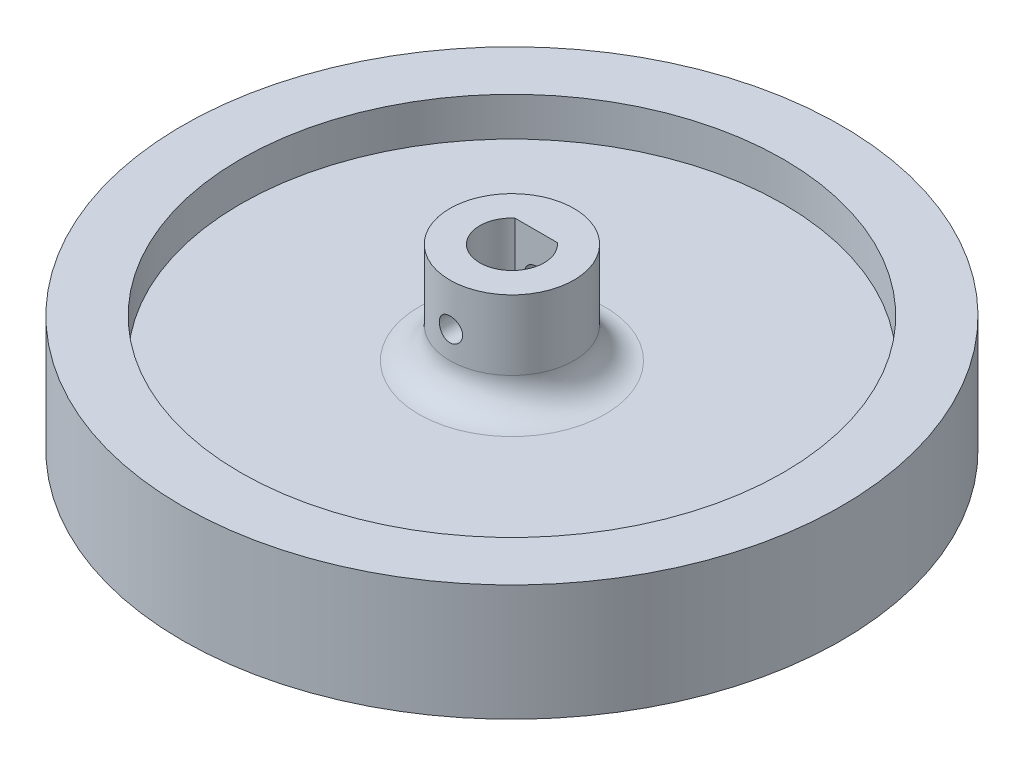
ISO-10303-21;
HEADER;
FILE_DESCRIPTION(('STEP AP214'),'2;1');
FILE_NAME('part.step','',(''),(''),'','','');
FILE_SCHEMA(('AUTOMOTIVE_DESIGN { 1 0 10303 214 1 1 1 1 }'));
ENDSEC;
DATA;
#1=APPLICATION_CONTEXT('core data for automotive mechanical design processes');
#2=APPLICATION_PROTOCOL_DEFINITION('international standard','automotive_design',2000,#1);
#3=PRODUCT_CONTEXT('',#1,'mechanical');
#4=PRODUCT('Part','Part','',(#3));
#5=PRODUCT_RELATED_PRODUCT_CATEGORY('part','',(#4));
#6=PRODUCT_DEFINITION_FORMATION('','',#4);
#7=PRODUCT_DEFINITION_CONTEXT('part definition',#1,'design');
#8=PRODUCT_DEFINITION('design','',#6,#7);
#9=PRODUCT_DEFINITION_SHAPE('','',#8);
#10=(LENGTH_UNIT() NAMED_UNIT(*) SI_UNIT(.MILLI.,.METRE.));
#11=(NAMED_UNIT(*) PLANE_ANGLE_UNIT() SI_UNIT($,.RADIAN.));
#12=(NAMED_UNIT(*) SI_UNIT($,.STERADIAN.) SOLID_ANGLE_UNIT());
#13=UNCERTAINTY_MEASURE_WITH_UNIT(LENGTH_MEASURE(1.E-05),#10,'distance_accuracy_value','');
#14=(GEOMETRIC_REPRESENTATION_CONTEXT(3) GLOBAL_UNCERTAINTY_ASSIGNED_CONTEXT((#13)) GLOBAL_UNIT_ASSIGNED_CONTEXT((#10,
#11,#12)) REPRESENTATION_CONTEXT('',''));
#15=CARTESIAN_POINT('',(0.,0.,0.));
#16=DIRECTION('',(0.,0.,1.));
#17=DIRECTION('',(1.,0.,0.));
#18=AXIS2_PLACEMENT_3D('',#15,#16,#17);
#19=CARTESIAN_POINT('',(0.,15.5,0.));
#20=DIRECTION('',(0.,-1.,0.));
#21=DIRECTION('',(0.,0.,-1.));
#22=AXIS2_PLACEMENT_3D('',#19,#20,#21);
#23=CYLINDRICAL_SURFACE('',#22,8.);
#24=CARTESIAN_POINT('',(0.,6.5,0.));
#25=DIRECTION('',(0.,1.,0.));
#26=DIRECTION('',(0.,0.,1.));
#27=AXIS2_PLACEMENT_3D('',#24,#25,#26);
#28=CIRCLE('',#27,8.);
#29=CARTESIAN_POINT('',(0.,6.5,8.));
#30=VERTEX_POINT('',#29);
#31=EDGE_CURVE('E57',#30,#30,#28,.T.);
#32=ORIENTED_EDGE('',*,*,#31,.T.);
#33=EDGE_LOOP('',(#32));
#34=FACE_BOUND('',#33,.T.);
#35=CARTESIAN_POINT('',(0.,15.5,0.));
#36=DIRECTION('',(0.,1.,0.));
#37=DIRECTION('',(0.,0.,1.));
#38=AXIS2_PLACEMENT_3D('',#35,#36,#37);
#39=CIRCLE('',#38,8.);
#40=CARTESIAN_POINT('',(0.,15.5,8.));
#41=VERTEX_POINT('',#40);
#42=EDGE_CURVE('E89',#41,#41,#39,.T.);
#43=ORIENTED_EDGE('',*,*,#42,.F.);
#44=EDGE_LOOP('',(#43));
#45=FACE_BOUND('',#44,.T.);
#46=CARTESIAN_POINT('',(-1.5,10.,7.85811682275085));
#47=CARTESIAN_POINT('',(-1.49999679883246,9.91654279198826,7.85811843793493));
#48=CARTESIAN_POINT('',(-1.49301126348936,9.83304405178161,7.85946079760266));
#49=CARTESIAN_POINT('',(-1.46527253251805,9.66840103841809,7.86467851014364));
#50=CARTESIAN_POINT('',(-1.44450765768477,9.58725882357252,7.86855601173205));
#51=CARTESIAN_POINT('',(-1.38987035617788,9.42973492862913,7.87838976464885));
#52=CARTESIAN_POINT('',(-1.35601013954374,9.35334889069271,7.88434407905997));
#53=CARTESIAN_POINT('',(-1.27617565760366,9.20734644071319,7.89765826320959));
#54=CARTESIAN_POINT('',(-1.23020233759193,9.1377295009967,7.90501802325622));
#55=CARTESIAN_POINT('',(-1.12683678942622,9.00636980080087,7.92041614838944));
#56=CARTESIAN_POINT('',(-1.06932292933092,8.94472351652827,7.92846116625679));
#57=CARTESIAN_POINT('',(-0.944771778803552,8.83189561040044,7.94426457664034));
#58=CARTESIAN_POINT('',(-0.877733863624945,8.78071467557521,7.95202295031153));
#59=CARTESIAN_POINT('',(-0.735403894570163,8.68990062339948,7.96645017828405));
#60=CARTESIAN_POINT('',(-0.660052840033866,8.65035846648058,7.97311028052363));
#61=CARTESIAN_POINT('',(-0.503631283250763,8.58453045772647,7.98451608632931));
#62=CARTESIAN_POINT('',(-0.422561251859506,8.55824351600978,7.98926194728334));
#63=CARTESIAN_POINT('',(-0.258002746187416,8.51997045138887,7.99625755123778));
#64=CARTESIAN_POINT('',(-0.174553323244857,8.50782169407731,7.99853565976327));
#65=CARTESIAN_POINT('',(-0.00677167603538331,8.4976631122996,8.00043684615594));
#66=CARTESIAN_POINT('',(0.0775604724476698,8.49965208386094,8.00006015010697));
#67=CARTESIAN_POINT('',(0.243598357899396,8.51758777114715,7.99671633763241));
#68=CARTESIAN_POINT('',(0.325323760451469,8.53335936943001,7.99378172247214));
#69=CARTESIAN_POINT('',(0.484947165715475,8.57813564939524,7.98568826333561));
#70=CARTESIAN_POINT('',(0.56284502882654,8.6071408133458,7.98052933829966));
#71=CARTESIAN_POINT('',(0.71311006575152,8.6777277310583,7.96851260297339));
#72=CARTESIAN_POINT('',(0.785443571838532,8.7193794879125,7.96164537590825));
#73=CARTESIAN_POINT('',(0.922159977214637,8.81402566907715,7.9469714754285));
#74=CARTESIAN_POINT('',(0.986542066910784,8.86702124688758,7.93916470651164));
#75=CARTESIAN_POINT('',(1.10656561896904,8.98381570298353,7.92333513680567));
#76=CARTESIAN_POINT('',(1.16205790757041,9.04776778390208,7.91531085901621));
#77=CARTESIAN_POINT('',(1.2615517185126,9.18414953127862,7.90006508924621));
#78=CARTESIAN_POINT('',(1.30555307271182,9.25657932176463,7.89284360901351));
#79=CARTESIAN_POINT('',(1.38085852224478,9.40805827070266,7.88001893307121));
#80=CARTESIAN_POINT('',(1.41214093645421,9.48711845719064,7.87441850530261));
#81=CARTESIAN_POINT('',(1.46093656975056,9.6495011841232,7.86551242396689));
#82=CARTESIAN_POINT('',(1.47845134901108,9.73282324046479,7.8622065103862));
#83=CARTESIAN_POINT('',(1.49899672649739,9.90001932885588,7.85831520301005));
#84=CARTESIAN_POINT('',(1.50224164285859,9.98386611556552,7.85768955816137));
#85=CARTESIAN_POINT('',(1.49472968881724,10.1509034550871,7.8591219142084));
#86=CARTESIAN_POINT('',(1.48397351086433,10.2340940401481,7.86117978238611));
#87=CARTESIAN_POINT('',(1.44894868195883,10.3967529030544,7.86770980063205));
#88=CARTESIAN_POINT('',(1.4247923858399,10.4762462526249,7.87216186690878));
#89=CARTESIAN_POINT('',(1.3637722437906,10.6300571897302,7.88296134156619));
#90=CARTESIAN_POINT('',(1.32690746128795,10.7043743953153,7.88930888963281));
#91=CARTESIAN_POINT('',(1.2410235311966,10.8466676190432,7.90327577863685));
#92=CARTESIAN_POINT('',(1.19186899639621,10.9145605378661,7.91090895425315));
#93=CARTESIAN_POINT('',(1.08298344344247,11.0412120402143,7.926548113681));
#94=CARTESIAN_POINT('',(1.02325147433084,11.0999698015558,7.93455413096494));
#95=CARTESIAN_POINT('',(0.893949417870386,11.2074837635341,7.95016624005946));
#96=CARTESIAN_POINT('',(0.824258534095891,11.256095826606,7.95776555833305));
#97=CARTESIAN_POINT('',(0.677574523040141,11.3409212061777,7.97159404810351));
#98=CARTESIAN_POINT('',(0.600581677038529,11.377135000025,7.97782327234725));
#99=CARTESIAN_POINT('',(0.441877541578685,11.4359200978641,7.98818057995848));
#100=CARTESIAN_POINT('',(0.360193213078989,11.4585621875614,7.99231954730142));
#101=CARTESIAN_POINT('',(0.194096227381571,11.4897870482899,7.99807642083745));
#102=CARTESIAN_POINT('',(0.109683858215851,11.4983712986627,7.99969459229933));
#103=CARTESIAN_POINT('',(-0.0580907602505088,11.5011853015184,8.00022227515441));
#104=CARTESIAN_POINT('',(-0.141449307066268,11.4956327531295,7.99917286625032));
#105=CARTESIAN_POINT('',(-0.306023369279199,11.4708075722316,7.99456866611703));
#106=CARTESIAN_POINT('',(-0.387238905213689,11.4515350712558,7.99101389890671));
#107=CARTESIAN_POINT('',(-0.545106475595484,11.3999087926163,7.98179837978045));
#108=CARTESIAN_POINT('',(-0.621766319318224,11.367578187119,7.97614135981576));
#109=CARTESIAN_POINT('',(-0.768605631316694,11.2907795463448,7.96333372068771));
#110=CARTESIAN_POINT('',(-0.83878466500327,11.2463106978933,7.95618300146483));
#111=CARTESIAN_POINT('',(-0.971755027780005,11.1457485455577,7.94104779859941));
#112=CARTESIAN_POINT('',(-1.03442623539053,11.0894979661383,7.93305284591272));
#113=CARTESIAN_POINT('',(-1.14951536065485,10.9672954375073,7.91719633538833));
#114=CARTESIAN_POINT('',(-1.2019308632478,10.9013412096263,7.90933480936765));
#115=CARTESIAN_POINT('',(-1.29547633945385,10.7608735452967,7.89455577425926));
#116=CARTESIAN_POINT('',(-1.33649740531872,10.6862865603324,7.88764767280729));
#117=CARTESIAN_POINT('',(-1.40536132423416,10.5311742100203,7.87567084650033));
#118=CARTESIAN_POINT('',(-1.43321661638912,10.4506545334106,7.87060038649116));
#119=CARTESIAN_POINT('',(-1.46929726596175,10.3082477119341,7.86393016292125));
#120=CARTESIAN_POINT('',(-1.4807910573985,10.2471942762381,7.86176310717932));
#121=CARTESIAN_POINT('',(-1.49614351076215,10.1241015315797,7.85885585595504));
#122=CARTESIAN_POINT('',(-1.50000238052127,10.0620622494997,7.85811562163282));
#123=CARTESIAN_POINT('',(-1.5,10.,7.85811682275085));
#124=B_SPLINE_CURVE_WITH_KNOTS('',3,(#46,#47,#48,#49,#50,#51,#52,#53,#54,#55,#56,#57,#58,#59,
#60,#61,#62,#63,#64,#65,#66,#67,#68,#69,#70,#71,#72,#73,#74,#75,#76,#77,#78,#79,#80,#81,#82,#83,
#84,#85,#86,#87,#88,#89,#90,#91,#92,#93,#94,#95,#96,#97,#98,#99,#100,#101,#102,#103,#104,#105,
#106,#107,#108,#109,#110,#111,#112,#113,#114,#115,#116,#117,#118,#119,#120,#121,#122,#123),
.UNSPECIFIED.,.T.,.F.,(4,2,2,2,2,2,2,2,2,2,2,2,2,2,2,2,2,2,2,2,2,2,2,2,2,2,2,2,2,2,2,2,2,2,2,2,
2,2,4),(0.,0.250144505793185,0.500501302380392,0.750625227978431,1.00072963993908,
1.25362335698691,1.50653367069315,1.76137104348047,2.0161874593964,2.26804275460261,
2.51987660200648,2.76855650598725,3.01724547328424,3.26733691984219,3.51745380911785,
3.77140614764064,4.025362201924,4.27974936118266,4.53410768866487,4.78463248587075,
5.03514489338718,5.28358792315369,5.53204926624317,5.78337862654143,6.03473059394677,
6.2894412549587,6.54414210821705,6.79750269418683,7.0508366166733,7.30029300570138,
7.54974700322167,7.79876026530358,8.0477902135711,8.30038464008745,8.55303847730765,
8.80803001818118,9.06278015749119,9.24880307527215,9.43482092920425),.UNSPECIFIED.);
#125=CARTESIAN_POINT('',(-1.5,10.,7.85811682275085));
#126=VERTEX_POINT('',#125);
#127=EDGE_CURVE('E98',#126,#126,#124,.T.);
#128=ORIENTED_EDGE('',*,*,#127,.F.);
#129=EDGE_LOOP('',(#128));
#130=FACE_BOUND('',#129,.T.);
#131=CARTESIAN_POINT('',(0.,11.5,-8.));
#132=CARTESIAN_POINT('',(0.0834717464654708,11.4999968104117,-7.99999848833852));
#133=CARTESIAN_POINT('',(0.166984992730098,11.4930089233806,-7.99868009921714));
#134=CARTESIAN_POINT('',(0.331658129841797,11.4652600048817,-7.9935478589052));
#135=CARTESIAN_POINT('',(0.412815974152225,11.4444873493603,-7.98973190166897));
#136=CARTESIAN_POINT('',(0.570372961851801,11.3898272987407,-7.98003138765458));
#137=CARTESIAN_POINT('',(0.646776330685343,11.3559517475475,-7.97414869946483));
#138=CARTESIAN_POINT('',(0.792807973094006,11.2760811230772,-7.96095710599783));
#139=CARTESIAN_POINT('',(0.862436794477323,11.2300870308552,-7.9536483161829));
#140=CARTESIAN_POINT('',(0.993783715930502,11.1267002319963,-7.93831336430504));
#141=CARTESIAN_POINT('',(1.05540895503183,11.0691905553299,-7.93028034856351));
#142=CARTESIAN_POINT('',(1.16819606135369,10.9446566909124,-7.9144531845865));
#143=CARTESIAN_POINT('',(1.21935717689241,10.8776318202307,-7.90665905354527));
#144=CARTESIAN_POINT('',(1.31014998665793,10.735313911636,-7.89212551245005));
#145=CARTESIAN_POINT('',(1.34968721969605,10.6599596296828,-7.88539493886182));
#146=CARTESIAN_POINT('',(1.41550524332283,10.5035310848232,-7.87384713211987));
#147=CARTESIAN_POINT('',(1.44178717713098,10.4224573158888,-7.86902973396962));
#148=CARTESIAN_POINT('',(1.480050535035,10.2578847690856,-7.8619226957455));
#149=CARTESIAN_POINT('',(1.49219390192039,10.1744249027965,-7.85960445366405));
#150=CARTESIAN_POINT('',(1.50233808095346,10.0066226151918,-7.85767197152761));
#151=CARTESIAN_POINT('',(1.50034016135374,9.9222802736977,-7.8580574889876));
#152=CARTESIAN_POINT('',(1.48238979602362,9.75628047473395,-7.86146292701753));
#153=CARTESIAN_POINT('',(1.46662149996045,9.67460228569985,-7.86444808147334));
#154=CARTESIAN_POINT('',(1.42186799396207,9.51507158021739,-7.87266183284666));
#155=CARTESIAN_POINT('',(1.39288222239499,9.4372192264907,-7.87789052509516));
#156=CARTESIAN_POINT('',(1.322336471793,9.28701132099973,-7.89003855292589));
#157=CARTESIAN_POINT('',(1.28070213532456,9.21469152941919,-7.89696783823366));
#158=CARTESIAN_POINT('',(1.18609368930416,9.07799527145977,-7.91172971602918));
#159=CARTESIAN_POINT('',(1.13311842889266,9.0136196122852,-7.91956240015522));
#160=CARTESIAN_POINT('',(1.01633905685298,8.89357504432754,-7.93540001272164));
#161=CARTESIAN_POINT('',(0.952377436860682,8.83805934754826,-7.94340571024031));
#162=CARTESIAN_POINT('',(0.815968037098826,8.73852275932459,-7.95857386108318));
#163=CARTESIAN_POINT('',(0.743520172255769,8.69450198312958,-7.96573630595245));
#164=CARTESIAN_POINT('',(0.592034988874667,8.61918224612998,-7.97842539677509));
#165=CARTESIAN_POINT('',(0.512989564446493,8.5878992208821,-7.98394999136289));
#166=CARTESIAN_POINT('',(0.350639115398696,8.53909790690784,-7.99272505402719));
#167=CARTESIAN_POINT('',(0.267334544277787,8.52157815595464,-7.99597576367994));
#168=CARTESIAN_POINT('',(0.100148652903385,8.50101396898173,-7.99980360641981));
#169=CARTESIAN_POINT('',(0.0162940126341357,8.49775960847027,-8.00041950912279));
#170=CARTESIAN_POINT('',(-0.150761248092183,8.50525547954765,-7.99901543598228));
#171=CARTESIAN_POINT('',(-0.233961900480385,8.51600502306526,-7.99699558964431));
#172=CARTESIAN_POINT('',(-0.396681573218217,8.55102903518337,-7.99057111500406));
#173=CARTESIAN_POINT('',(-0.476224261046063,8.57519728253781,-7.98618522374031));
#174=CARTESIAN_POINT('',(-0.630128631824632,8.63625770677879,-7.97551842212498));
#175=CARTESIAN_POINT('',(-0.704489962595103,8.67315074756579,-7.96923738311334));
#176=CARTESIAN_POINT('',(-0.846816671513214,8.75907812815951,-7.95538030357666));
#177=CARTESIAN_POINT('',(-0.914703277015121,8.80824073853684,-7.94779086174563));
#178=CARTESIAN_POINT('',(-1.04133832326454,8.91713813736236,-7.93219343489712));
#179=CARTESIAN_POINT('',(-1.10008590976087,8.97687391300133,-7.92418541084687));
#180=CARTESIAN_POINT('',(-1.20757295872048,9.10617231891143,-7.9085247569745));
#181=CARTESIAN_POINT('',(-1.25616916218577,9.17585490812539,-7.90087825860257));
#182=CARTESIAN_POINT('',(-1.34096675057787,9.32251762452375,-7.88692985578532));
#183=CARTESIAN_POINT('',(-1.37716859613924,9.39949748037047,-7.8806279013735));
#184=CARTESIAN_POINT('',(-1.43594673512823,9.55820586724254,-7.87013024209574));
#185=CARTESIAN_POINT('',(-1.45858868794786,9.63990937955933,-7.86592440436878));
#186=CARTESIAN_POINT('',(-1.48980679326235,9.8060472225214,-7.86007203802415));
#187=CARTESIAN_POINT('',(-1.49838453270708,9.8904812439704,-7.8584252206579));
#188=CARTESIAN_POINT('',(-1.50117762148355,10.0582483314415,-7.85789199803857));
#189=CARTESIAN_POINT('',(-1.49561895003499,10.141577580957,-7.85896215974293));
#190=CARTESIAN_POINT('',(-1.47079175378803,10.3060914220453,-7.86364600659998));
#191=CARTESIAN_POINT('',(-1.45152331089332,10.3872760264274,-7.86725967655747));
#192=CARTESIAN_POINT('',(-1.39991887583263,10.5450744847955,-7.8766050802318));
#193=CARTESIAN_POINT('',(-1.36760735397252,10.6216965913458,-7.88233284594965));
#194=CARTESIAN_POINT('',(-1.29085868912204,10.7684682542408,-7.8952638755184));
#195=CARTESIAN_POINT('',(-1.24642068948186,10.8386173528448,-7.90246724360119));
#196=CARTESIAN_POINT('',(-1.14589487339535,10.9715836800423,-7.91767266107745));
#197=CARTESIAN_POINT('',(-1.08964259864303,11.0342754125671,-7.92568505353043));
#198=CARTESIAN_POINT('',(-0.96742792674229,11.1494051624645,-7.94152833918735));
#199=CARTESIAN_POINT('',(-0.901463301891615,11.2018408209801,-7.94935919027328));
#200=CARTESIAN_POINT('',(-0.760984945071872,11.2954109526271,-7.96403975968049));
#201=CARTESIAN_POINT('',(-0.686399590640516,11.3364394284906,-7.97088000990561));
#202=CARTESIAN_POINT('',(-0.531290113653833,11.4053176366051,-7.98271619380687));
#203=CARTESIAN_POINT('',(-0.450771651705247,11.4331797470469,-7.98771385879037));
#204=CARTESIAN_POINT('',(-0.308347202825153,11.4692773144187,-7.99428290707632));
#205=CARTESIAN_POINT('',(-0.24727381025187,11.4807786303128,-7.99641470878206));
#206=CARTESIAN_POINT('',(-0.124141247115158,11.4961410621164,-7.9992737995401));
#207=CARTESIAN_POINT('',(-0.0620821016527094,11.5000023722559,-8.00000112429805));
#208=CARTESIAN_POINT('',(0.,11.5,-8.));
#209=B_SPLINE_CURVE_WITH_KNOTS('',3,(#131,#132,#133,#134,#135,#136,#137,#138,#139,#140,#141,
#142,#143,#144,#145,#146,#147,#148,#149,#150,#151,#152,#153,#154,#155,#156,#157,#158,#159,#160,
#161,#162,#163,#164,#165,#166,#167,#168,#169,#170,#171,#172,#173,#174,#175,#176,#177,#178,#179,
#180,#181,#182,#183,#184,#185,#186,#187,#188,#189,#190,#191,#192,#193,#194,#195,#196,#197,#198,
#199,#200,#201,#202,#203,#204,#205,#206,#207,#208),.UNSPECIFIED.,.T.,.F.,(4,2,2,2,2,2,2,2,2,2,2,
2,2,2,2,2,2,2,2,2,2,2,2,2,2,2,2,2,2,2,2,2,2,2,2,2,2,2,4),(0.,0.250188200964924,
0.500587642535452,0.750761271230907,1.00091465336891,1.2537511801363,1.50660586283617,
1.76146190504357,2.01629596311949,2.26818151445336,2.52004447587256,2.76859000612766,
3.01714609846787,3.26719262629531,3.51726454049859,3.77127768464077,4.02529337544948,
4.27962588321699,4.53393136673745,4.78448174076096,5.03501980464583,5.28360233907828,
5.53220175338032,5.78351778017708,6.03485728413098,6.28953436987299,6.54420198954945,
6.79762627818559,7.05102196946513,7.30039252231748,7.54976158541506,7.79866496207692,
8.04758592655423,8.3002336996638,8.55293951262255,8.80792048916314,9.06266126931173,
9.24874344524409,9.43482089039541),.UNSPECIFIED.);
#210=CARTESIAN_POINT('',(0.,11.5,-8.));
#211=VERTEX_POINT('',#210);
#212=EDGE_CURVE('E94',#211,#211,#209,.T.);
#213=ORIENTED_EDGE('',*,*,#212,.F.);
#214=EDGE_LOOP('',(#213));
#215=FACE_BOUND('',#214,.T.);
#216=ADVANCED_FACE('F47',(#34,#45,#130,#215),#23,.T.);
#217=CARTESIAN_POINT('',(0.,15.5,0.));
#218=DIRECTION('',(0.,-1.,0.));
#219=DIRECTION('',(0.,0.,-1.));
#220=AXIS2_PLACEMENT_3D('',#217,#218,#219);
#221=CYLINDRICAL_SURFACE('',#220,4.15);
#222=CARTESIAN_POINT('',(0.,2.5,0.));
#223=DIRECTION('',(0.,1.,0.));
#224=DIRECTION('',(0.,0.,1.));
#225=AXIS2_PLACEMENT_3D('',#222,#223,#224);
#226=CIRCLE('',#225,4.15);
#227=CARTESIAN_POINT('',(-2.74496698526911,2.5,-3.11249999996507));
#228=VERTEX_POINT('',#227);
#229=CARTESIAN_POINT('',(2.74496698526911,2.5,-3.11249999996508));
#230=VERTEX_POINT('',#229);
#231=EDGE_CURVE('E71',#228,#230,#226,.T.);
#232=ORIENTED_EDGE('',*,*,#231,.F.);
#233=DIRECTION('',(0.,-1.,0.));
#234=VECTOR('',#233,1.);
#235=CARTESIAN_POINT('',(-2.74496698526911,15.5,-3.11249999996507));
#236=LINE('',#235,#234);
#237=CARTESIAN_POINT('',(-2.74496698526911,15.5,-3.11249999996507));
#238=VERTEX_POINT('',#237);
#239=EDGE_CURVE('E79',#238,#228,#236,.T.);
#240=ORIENTED_EDGE('',*,*,#239,.F.);
#241=CARTESIAN_POINT('',(0.,15.5,0.));
#242=DIRECTION('',(0.,1.,0.));
#243=DIRECTION('',(0.,0.,1.));
#244=AXIS2_PLACEMENT_3D('',#241,#242,#243);
#245=CIRCLE('',#244,4.15);
#246=CARTESIAN_POINT('',(2.74496698526911,15.5,-3.11249999996508));
#247=VERTEX_POINT('',#246);
#248=EDGE_CURVE('E82',#238,#247,#245,.T.);
#249=ORIENTED_EDGE('',*,*,#248,.T.);
#250=DIRECTION('',(0.,-1.,0.));
#251=VECTOR('',#250,1.);
#252=CARTESIAN_POINT('',(2.74496698526911,15.5,-3.11249999996508));
#253=LINE('',#252,#251);
#254=EDGE_CURVE('E64',#247,#230,#253,.T.);
#255=ORIENTED_EDGE('',*,*,#254,.T.);
#256=EDGE_LOOP('',(#232,#240,#249,#255));
#257=FACE_BOUND('',#256,.T.);
#258=CARTESIAN_POINT('',(-1.5,10.,3.86943148278917));
#259=CARTESIAN_POINT('',(-1.50000204617039,9.91875663948298,3.86942965987514));
#260=CARTESIAN_POINT('',(-1.49337742480288,9.83752729633314,3.8720180417576));
#261=CARTESIAN_POINT('',(-1.46716389412437,9.67750353049271,3.88202574833964));
#262=CARTESIAN_POINT('',(-1.44757460141219,9.59870917988371,3.88944521590768));
#263=CARTESIAN_POINT('',(-1.3962327859776,9.44590631255081,3.90816721246071));
#264=CARTESIAN_POINT('',(-1.36450757310196,9.37188748324943,3.91946101705452));
#265=CARTESIAN_POINT('',(-1.28989018879869,9.23019530752994,3.94464557685853));
#266=CARTESIAN_POINT('',(-1.24699493388767,9.16252372029138,3.95853704885431));
#267=CARTESIAN_POINT('',(-1.14913649213948,9.03232661061548,3.98806965416322));
#268=CARTESIAN_POINT('',(-1.09374289340615,8.97013560626437,4.00375971531451));
#269=CARTESIAN_POINT('',(-0.97337520313558,8.85569264901198,4.034711704888));
#270=CARTESIAN_POINT('',(-0.908399253321232,8.80344262844743,4.04997354958261));
#271=CARTESIAN_POINT('',(-0.768203530001208,8.70878534355175,4.07892597308986));
#272=CARTESIAN_POINT('',(-0.692726816994578,8.6667372701131,4.09255243408543));
#273=CARTESIAN_POINT('',(-0.53519237998701,8.59607175193303,4.11611459871196));
#274=CARTESIAN_POINT('',(-0.453136774536789,8.56745000379229,4.12605148471053));
#275=CARTESIAN_POINT('',(-0.288287564229631,8.52560964231356,4.14076783336458));
#276=CARTESIAN_POINT('',(-0.205657349029418,8.51181608586402,4.14573922834442));
#277=CARTESIAN_POINT('',(-0.0391154762948344,8.49818621064365,4.15065072565593));
#278=CARTESIAN_POINT('',(0.0447957862882929,8.49834567365044,4.15059234856874));
#279=CARTESIAN_POINT('',(0.207414311328064,8.51227238174316,4.14557567575914));
#280=CARTESIAN_POINT('',(0.286183368965905,8.52541315502518,4.14084296334113));
#281=CARTESIAN_POINT('',(0.440311953877129,8.56388168193396,4.12730099688341));
#282=CARTESIAN_POINT('',(0.515671241724631,8.58921028991293,4.11849145706477));
#283=CARTESIAN_POINT('',(0.662104045788294,8.65165095215931,4.09752014235388));
#284=CARTESIAN_POINT('',(0.733101756138566,8.68892479766714,4.08531266164164));
#285=CARTESIAN_POINT('',(0.868005746156515,8.77405829879575,4.05879286142779));
#286=CARTESIAN_POINT('',(0.931909823832644,8.82192122773586,4.04447989153247));
#287=CARTESIAN_POINT('',(1.05451728897978,8.92994040057251,4.01431151466932));
#288=CARTESIAN_POINT('',(1.11274479884602,8.99062599035831,3.99841456246193));
#289=CARTESIAN_POINT('',(1.21836738821606,9.12101070456067,3.96750760479459));
#290=CARTESIAN_POINT('',(1.26576013087801,9.19071176836793,3.95249779118925));
#291=CARTESIAN_POINT('',(1.34918945809022,9.33890013712379,3.92481391025065));
#292=CARTESIAN_POINT('',(1.38498878508573,9.41753125244823,3.91219060898157));
#293=CARTESIAN_POINT('',(1.44266391069934,9.58028102019117,3.89129452581236));
#294=CARTESIAN_POINT('',(1.46454679958814,9.66439685408208,3.88301952887341));
#295=CARTESIAN_POINT('',(1.49272401073424,9.83105430914674,3.87227220184197));
#296=CARTESIAN_POINT('',(1.49976847955059,9.91345103310467,3.86952098665052));
#297=CARTESIAN_POINT('',(1.50022011718802,10.0782772678379,3.86934639938099));
#298=CARTESIAN_POINT('',(1.49363035783656,10.1607067670455,3.8719218271962));
#299=CARTESIAN_POINT('',(1.46767892086844,10.3195632532701,3.88182878028342));
#300=CARTESIAN_POINT('',(1.44887662174212,10.3960960971024,3.88895177716225));
#301=CARTESIAN_POINT('',(1.39972653669555,10.544892769429,3.90690994887044));
#302=CARTESIAN_POINT('',(1.36937648859853,10.6171557582624,3.91774585100781));
#303=CARTESIAN_POINT('',(1.29676967748183,10.7582250764582,3.94238557334163));
#304=CARTESIAN_POINT('',(1.25412675132682,10.8268161042813,3.95628148710211));
#305=CARTESIAN_POINT('',(1.15856425883873,10.956137089807,3.98531294266546));
#306=CARTESIAN_POINT('',(1.10564116830254,11.0168643397494,4.00044890854598));
#307=CARTESIAN_POINT('',(0.987376007772962,11.1323914819451,4.03131865587011));
#308=CARTESIAN_POINT('',(0.921490860515431,11.1866416255732,4.04703604350514));
#309=CARTESIAN_POINT('',(0.781164422593054,11.2833715296547,4.07644627550283));
#310=CARTESIAN_POINT('',(0.706723238021,11.325851436034,4.09013914496421));
#311=CARTESIAN_POINT('',(0.551573789215125,11.3975083987312,4.11392623755102));
#312=CARTESIAN_POINT('',(0.470897122012955,11.42674796031,4.12403731929383));
#313=CARTESIAN_POINT('',(0.305325464244327,11.4710923567192,4.1395864929142));
#314=CARTESIAN_POINT('',(0.220432315225941,11.4862033060358,4.14502660617892));
#315=CARTESIAN_POINT('',(0.0538252283509382,11.5012378160601,4.15044227784074));
#316=CARTESIAN_POINT('',(-0.0278095178903257,11.5019448849707,4.15069974021066));
#317=CARTESIAN_POINT('',(-0.189982239519513,11.4901391296859,4.14644234311778));
#318=CARTESIAN_POINT('',(-0.270520330811835,11.4776277136977,4.14192799201143));
#319=CARTESIAN_POINT('',(-0.426476778783461,11.4402821304314,4.12875502298679));
#320=CARTESIAN_POINT('',(-0.501967742306186,11.4157168455167,4.12018697280803));
#321=CARTESIAN_POINT('',(-0.647771311269437,11.3552216435094,4.09979478577945));
#322=CARTESIAN_POINT('',(-0.718082939756945,11.3192895890907,4.08797003661739));
#323=CARTESIAN_POINT('',(-0.854650380626584,11.2354158913278,4.06166294940567));
#324=CARTESIAN_POINT('',(-0.920626051702564,11.1870462823186,4.04709227838616));
#325=CARTESIAN_POINT('',(-1.04377148382961,11.0803624424897,4.01709660379255));
#326=CARTESIAN_POINT('',(-1.10093818810491,11.0220447743456,4.00167130616988));
#327=CARTESIAN_POINT('',(-1.20766398088416,10.8937764904472,3.97080404711533));
#328=CARTESIAN_POINT('',(-1.25672448263168,10.8234010709974,3.95539701694856));
#329=CARTESIAN_POINT('',(-1.34232255511236,10.6749161503227,3.92717581779821));
#330=CARTESIAN_POINT('',(-1.37886048168202,10.5968068689414,3.91436157514325));
#331=CARTESIAN_POINT('',(-1.4385434189824,10.4338416984727,3.89282970703934));
#332=CARTESIAN_POINT('',(-1.4615011667654,10.3489090302654,3.88416965938765));
#333=CARTESIAN_POINT('',(-1.49222427480715,10.1759776482319,3.87247304247593));
#334=CARTESIAN_POINT('',(-1.49999778414744,10.0879806048207,3.86943345687145));
#335=CARTESIAN_POINT('',(-1.5,10.,3.86943148278917));
#336=B_SPLINE_CURVE_WITH_KNOTS('',3,(#258,#259,#260,#261,#262,#263,#264,#265,#266,#267,#268,
#269,#270,#271,#272,#273,#274,#275,#276,#277,#278,#279,#280,#281,#282,#283,#284,#285,#286,#287,
#288,#289,#290,#291,#292,#293,#294,#295,#296,#297,#298,#299,#300,#301,#302,#303,#304,#305,#306,
#307,#308,#309,#310,#311,#312,#313,#314,#315,#316,#317,#318,#319,#320,#321,#322,#323,#324,#325,
#326,#327,#328,#329,#330,#331,#332,#333,#334,#335),.UNSPECIFIED.,.T.,.F.,(4,2,2,2,2,2,2,2,2,2,2,
2,2,2,2,2,2,2,2,2,2,2,2,2,2,2,2,2,2,2,2,2,2,2,2,2,2,2,4),(0.,0.243403067815168,
0.486813334053783,0.729679038415541,0.972611856911654,1.22572565028795,1.47888859398037,
1.7399740667023,2.00097579915924,2.25144558676209,2.50183965357817,2.74071235083241,
2.97960179520871,3.22187426315946,3.46422172777814,3.71982943679342,3.97549222336123,
4.2360976456649,4.49657018580198,4.74352334207576,4.99042086521279,5.22673878899143,
5.46310303074854,5.70789999770294,5.95278103351322,6.21189677881468,6.47100931149018,
6.72888553168956,6.98665009821675,7.23035357253214,7.47403108695803,7.71250440650457,
7.95102259354818,8.19921426656626,8.44749187089459,8.70771918456738,8.96793910311139,
9.23166836289217,9.49525604544623),.UNSPECIFIED.);
#337=CARTESIAN_POINT('',(-1.5,10.,3.86943148278917));
#338=VERTEX_POINT('',#337);
#339=EDGE_CURVE('E187',#338,#338,#336,.T.);
#340=ORIENTED_EDGE('',*,*,#339,.T.);
#341=EDGE_LOOP('',(#340));
#342=FACE_BOUND('',#341,.T.);
#343=ADVANCED_FACE('F84',(#257,#342),#221,.F.);
#344=CARTESIAN_POINT('',(0.,2.5,0.));
#345=DIRECTION('',(0.,-1.,0.));
#346=DIRECTION('',(0.,0.,-1.));
#347=AXIS2_PLACEMENT_3D('',#344,#345,#346);
#348=CYLINDRICAL_SURFACE('',#347,4.175);
#349=CARTESIAN_POINT('',(0.,2.5,0.));
#350=DIRECTION('',(0.,1.,0.));
#351=DIRECTION('',(0.,0.,1.));
#352=AXIS2_PLACEMENT_3D('',#349,#350,#351);
#353=CIRCLE('',#352,4.175);
#354=CARTESIAN_POINT('',(0.,2.5,4.175));
#355=VERTEX_POINT('',#354);
#356=EDGE_CURVE('E109',#355,#355,#353,.T.);
#357=ORIENTED_EDGE('',*,*,#356,.T.);
#358=EDGE_LOOP('',(#357));
#359=FACE_BOUND('',#358,.T.);
#360=CARTESIAN_POINT('',(0.,-2.5,0.));
#361=DIRECTION('',(0.,1.,0.));
#362=DIRECTION('',(0.,0.,1.));
#363=AXIS2_PLACEMENT_3D('',#360,#361,#362);
#364=CIRCLE('',#363,4.175);
#365=CARTESIAN_POINT('',(0.,-2.5,4.175));
#366=VERTEX_POINT('',#365);
#367=EDGE_CURVE('E133',#366,#366,#364,.T.);
#368=ORIENTED_EDGE('',*,*,#367,.F.);
#369=EDGE_LOOP('',(#368));
#370=FACE_BOUND('',#369,.T.);
#371=ADVANCED_FACE('F167',(#359,#370),#348,.F.);
#372=CARTESIAN_POINT('',(0.,2.5,0.));
#373=DIRECTION('',(0.,1.,0.));
#374=DIRECTION('',(0.,0.,1.));
#375=AXIS2_PLACEMENT_3D('',#372,#373,#374);
#376=PLANE('',#375);
#377=CARTESIAN_POINT('',(0.,2.5,0.));
#378=DIRECTION('',(0.,1.,0.));
#379=DIRECTION('',(0.,0.,1.));
#380=AXIS2_PLACEMENT_3D('',#377,#378,#379);
#381=CIRCLE('',#380,12.);
#382=CARTESIAN_POINT('',(0.,2.5,12.));
#383=VERTEX_POINT('',#382);
#384=EDGE_CURVE('E11',#383,#383,#381,.F.);
#385=ORIENTED_EDGE('',*,*,#384,.T.);
#386=EDGE_LOOP('',(#385));
#387=FACE_BOUND('',#386,.T.);
#388=CARTESIAN_POINT('',(0.,2.5,0.));
#389=DIRECTION('',(0.,1.,0.));
#390=DIRECTION('',(0.,0.,1.));
#391=AXIS2_PLACEMENT_3D('',#388,#389,#390);
#392=CIRCLE('',#391,35.);
#393=CARTESIAN_POINT('',(0.,2.5,35.));
#394=VERTEX_POINT('',#393);
#395=EDGE_CURVE('E123',#394,#394,#392,.F.);
#396=ORIENTED_EDGE('',*,*,#395,.F.);
#397=EDGE_LOOP('',(#396));
#398=FACE_BOUND('',#397,.T.);
#399=ADVANCED_FACE('F305',(#387,#398),#376,.T.);
#400=CARTESIAN_POINT('',(0.,-2.5,0.));
#401=DIRECTION('',(0.,1.,0.));
#402=DIRECTION('',(0.,0.,1.));
#403=AXIS2_PLACEMENT_3D('',#400,#401,#402);
#404=PLANE('',#403);
#405=ORIENTED_EDGE('',*,*,#367,.T.);
#406=EDGE_LOOP('',(#405));
#407=FACE_BOUND('',#406,.T.);
#408=CARTESIAN_POINT('',(0.,-2.5,0.));
#409=DIRECTION('',(0.,1.,0.));
#410=DIRECTION('',(0.,0.,1.));
#411=AXIS2_PLACEMENT_3D('',#408,#409,#410);
#412=CIRCLE('',#411,35.);
#413=CARTESIAN_POINT('',(0.,-2.5,35.));
#414=VERTEX_POINT('',#413);
#415=EDGE_CURVE('E137',#414,#414,#412,.T.);
#416=ORIENTED_EDGE('',*,*,#415,.F.);
#417=EDGE_LOOP('',(#416));
#418=FACE_BOUND('',#417,.T.);
#419=ADVANCED_FACE('F297',(#407,#418),#404,.F.);
#420=CARTESIAN_POINT('',(0.,7.5,0.));
#421=DIRECTION('',(0.,-1.,0.));
#422=DIRECTION('',(0.,0.,-1.));
#423=AXIS2_PLACEMENT_3D('',#420,#421,#422);
#424=CYLINDRICAL_SURFACE('',#423,35.);
#425=CARTESIAN_POINT('',(0.,-7.5,0.));
#426=DIRECTION('',(0.,1.,0.));
#427=DIRECTION('',(0.,0.,1.));
#428=AXIS2_PLACEMENT_3D('',#425,#426,#427);
#429=CIRCLE('',#428,35.);
#430=CARTESIAN_POINT('',(0.,-7.5,35.));
#431=VERTEX_POINT('',#430);
#432=EDGE_CURVE('E113',#431,#431,#429,.T.);
#433=ORIENTED_EDGE('',*,*,#432,.F.);
#434=EDGE_LOOP('',(#433));
#435=FACE_BOUND('',#434,.T.);
#436=ORIENTED_EDGE('',*,*,#415,.T.);
#437=EDGE_LOOP('',(#436));
#438=FACE_BOUND('',#437,.T.);
#439=ADVANCED_FACE('F288',(#435,#438),#424,.F.);
#440=ORIENTED_EDGE('',*,*,#395,.T.);
#441=EDGE_LOOP('',(#440));
#442=FACE_BOUND('',#441,.T.);
#443=CARTESIAN_POINT('',(0.,7.5,0.));
#444=DIRECTION('',(0.,1.,0.));
#445=DIRECTION('',(0.,0.,1.));
#446=AXIS2_PLACEMENT_3D('',#443,#444,#445);
#447=CIRCLE('',#446,35.);
#448=CARTESIAN_POINT('',(0.,7.5,35.));
#449=VERTEX_POINT('',#448);
#450=EDGE_CURVE('E114',#449,#449,#447,.T.);
#451=ORIENTED_EDGE('',*,*,#450,.T.);
#452=EDGE_LOOP('',(#451));
#453=FACE_BOUND('',#452,.T.);
#454=ADVANCED_FACE('F279',(#442,#453),#424,.F.);
#455=CARTESIAN_POINT('',(0.,7.5,0.));
#456=DIRECTION('',(0.,-1.,0.));
#457=DIRECTION('',(0.,0.,-1.));
#458=AXIS2_PLACEMENT_3D('',#455,#456,#457);
#459=CYLINDRICAL_SURFACE('',#458,42.5);
#460=CARTESIAN_POINT('',(0.,7.5,0.));
#461=DIRECTION('',(0.,1.,0.));
#462=DIRECTION('',(0.,0.,1.));
#463=AXIS2_PLACEMENT_3D('',#460,#461,#462);
#464=CIRCLE('',#463,42.5);
#465=CARTESIAN_POINT('',(0.,7.5,42.5));
#466=VERTEX_POINT('',#465);
#467=EDGE_CURVE('E118',#466,#466,#464,.T.);
#468=ORIENTED_EDGE('',*,*,#467,.F.);
#469=EDGE_LOOP('',(#468));
#470=FACE_BOUND('',#469,.T.);
#471=CARTESIAN_POINT('',(0.,-7.5,0.));
#472=DIRECTION('',(0.,1.,0.));
#473=DIRECTION('',(0.,0.,1.));
#474=AXIS2_PLACEMENT_3D('',#471,#472,#473);
#475=CIRCLE('',#474,42.5);
#476=CARTESIAN_POINT('',(0.,-7.5,42.5));
#477=VERTEX_POINT('',#476);
#478=EDGE_CURVE('E119',#477,#477,#475,.T.);
#479=ORIENTED_EDGE('',*,*,#478,.T.);
#480=EDGE_LOOP('',(#479));
#481=FACE_BOUND('',#480,.T.);
#482=ADVANCED_FACE('F271',(#470,#481),#459,.T.);
#483=CARTESIAN_POINT('',(0.,7.5,0.));
#484=DIRECTION('',(0.,1.,0.));
#485=DIRECTION('',(0.,0.,1.));
#486=AXIS2_PLACEMENT_3D('',#483,#484,#485);
#487=PLANE('',#486);
#488=ORIENTED_EDGE('',*,*,#450,.F.);
#489=EDGE_LOOP('',(#488));
#490=FACE_BOUND('',#489,.T.);
#491=ORIENTED_EDGE('',*,*,#467,.T.);
#492=EDGE_LOOP('',(#491));
#493=FACE_BOUND('',#492,.T.);
#494=ADVANCED_FACE('F173',(#490,#493),#487,.T.);
#495=CARTESIAN_POINT('',(0.,-7.5,0.));
#496=DIRECTION('',(0.,1.,0.));
#497=DIRECTION('',(0.,0.,1.));
#498=AXIS2_PLACEMENT_3D('',#495,#496,#497);
#499=PLANE('',#498);
#500=ORIENTED_EDGE('',*,*,#432,.T.);
#501=EDGE_LOOP('',(#500));
#502=FACE_BOUND('',#501,.T.);
#503=ORIENTED_EDGE('',*,*,#478,.F.);
#504=EDGE_LOOP('',(#503));
#505=FACE_BOUND('',#504,.T.);
#506=ADVANCED_FACE('F199',(#502,#505),#499,.F.);
#507=CARTESIAN_POINT('',(0.,2.5,0.));
#508=DIRECTION('',(0.,1.,0.));
#509=DIRECTION('',(0.,0.,1.));
#510=AXIS2_PLACEMENT_3D('',#507,#508,#509);
#511=PLANE('',#510);
#512=ORIENTED_EDGE('',*,*,#231,.T.);
#513=DIRECTION('',(-1.,0.,0.));
#514=VECTOR('',#513,1.);
#515=CARTESIAN_POINT('',(-2.74496698526911,2.5,-3.11249999996507));
#516=LINE('',#515,#514);
#517=EDGE_CURVE('E77',#230,#228,#516,.T.);
#518=ORIENTED_EDGE('',*,*,#517,.T.);
#519=EDGE_LOOP('',(#512,#518));
#520=FACE_BOUND('',#519,.T.);
#521=ORIENTED_EDGE('',*,*,#356,.F.);
#522=EDGE_LOOP('',(#521));
#523=FACE_BOUND('',#522,.T.);
#524=ADVANCED_FACE('F91',(#520,#523),#511,.F.);
#525=CARTESIAN_POINT('',(0.,15.5,0.));
#526=DIRECTION('',(0.,1.,0.));
#527=DIRECTION('',(0.,0.,1.));
#528=AXIS2_PLACEMENT_3D('',#525,#526,#527);
#529=PLANE('',#528);
#530=ORIENTED_EDGE('',*,*,#42,.T.);
#531=EDGE_LOOP('',(#530));
#532=FACE_BOUND('',#531,.T.);
#533=DIRECTION('',(-1.,0.,0.));
#534=VECTOR('',#533,1.);
#535=CARTESIAN_POINT('',(-2.74496698526911,15.5,-3.11249999996507));
#536=LINE('',#535,#534);
#537=EDGE_CURVE('E101',#247,#238,#536,.T.);
#538=ORIENTED_EDGE('',*,*,#537,.F.);
#539=ORIENTED_EDGE('',*,*,#248,.F.);
#540=EDGE_LOOP('',(#538,#539));
#541=FACE_BOUND('',#540,.T.);
#542=ADVANCED_FACE('F159',(#532,#541),#529,.T.);
#543=CARTESIAN_POINT('',(-2.74496698526911,15.5,-3.11249999996507));
#544=DIRECTION('',(0.,0.,1.));
#545=DIRECTION('',(1.,0.,0.));
#546=AXIS2_PLACEMENT_3D('',#543,#544,#545);
#547=PLANE('',#546);
#548=CARTESIAN_POINT('',(0.,10.,-3.11249999996507));
#549=DIRECTION('',(0.,0.,1.));
#550=DIRECTION('',(1.,0.,0.));
#551=AXIS2_PLACEMENT_3D('',#548,#549,#550);
#552=CIRCLE('',#551,1.5);
#553=CARTESIAN_POINT('',(1.5,10.,-3.11249999996507));
#554=VERTEX_POINT('',#553);
#555=EDGE_CURVE('E51',#554,#554,#552,.F.);
#556=ORIENTED_EDGE('',*,*,#555,.T.);
#557=EDGE_LOOP('',(#556));
#558=FACE_BOUND('',#557,.T.);
#559=ORIENTED_EDGE('',*,*,#517,.F.);
#560=ORIENTED_EDGE('',*,*,#254,.F.);
#561=ORIENTED_EDGE('',*,*,#537,.T.);
#562=ORIENTED_EDGE('',*,*,#239,.T.);
#563=EDGE_LOOP('',(#559,#560,#561,#562));
#564=FACE_BOUND('',#563,.T.);
#565=ADVANCED_FACE('F78',(#558,#564),#547,.T.);
#566=CARTESIAN_POINT('',(0.,6.5,0.));
#567=DIRECTION('',(0.,1.,0.));
#568=DIRECTION('',(0.,0.,1.));
#569=AXIS2_PLACEMENT_3D('',#566,#567,#568);
#570=TOROIDAL_SURFACE('',#569,12.,4.);
#571=ORIENTED_EDGE('',*,*,#384,.F.);
#572=EDGE_LOOP('',(#571));
#573=FACE_BOUND('',#572,.T.);
#574=ORIENTED_EDGE('',*,*,#31,.F.);
#575=EDGE_LOOP('',(#574));
#576=FACE_BOUND('',#575,.T.);
#577=ADVANCED_FACE('F49',(#573,#576),#570,.F.);
#578=CARTESIAN_POINT('',(0.,10.,12.5));
#579=DIRECTION('',(0.,0.,-1.));
#580=DIRECTION('',(-1.,0.,0.));
#581=AXIS2_PLACEMENT_3D('',#578,#579,#580);
#582=CYLINDRICAL_SURFACE('',#581,1.5);
#583=ORIENTED_EDGE('',*,*,#555,.F.);
#584=EDGE_LOOP('',(#583));
#585=FACE_BOUND('',#584,.T.);
#586=ORIENTED_EDGE('',*,*,#212,.T.);
#587=EDGE_LOOP('',(#586));
#588=FACE_BOUND('',#587,.T.);
#589=ADVANCED_FACE('F148',(#585,#588),#582,.F.);
#590=ORIENTED_EDGE('',*,*,#339,.F.);
#591=EDGE_LOOP('',(#590));
#592=FACE_BOUND('',#591,.T.);
#593=ORIENTED_EDGE('',*,*,#127,.T.);
#594=EDGE_LOOP('',(#593));
#595=FACE_BOUND('',#594,.T.);
#596=ADVANCED_FACE('F155',(#592,#595),#582,.F.);
#597=CLOSED_SHELL('',(#216,#343,#371,#399,#419,#439,#454,#482,#494,#506,#524,#542,#565,#577,
#589,#596));
#598=MANIFOLD_SOLID_BREP('B2',#597);
#599=ADVANCED_BREP_SHAPE_REPRESENTATION('',(#18,#598),#14);
#600=SHAPE_DEFINITION_REPRESENTATION(#9,#599);
ENDSEC;
END-ISO-10303-21;
